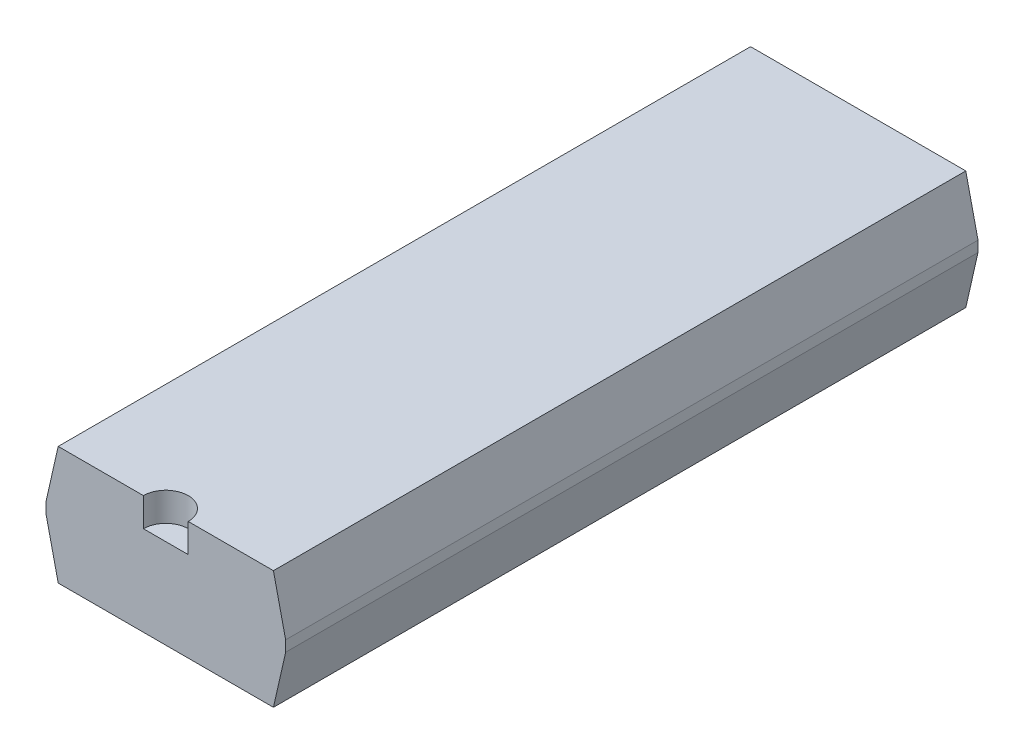
ISO-10303-21;
HEADER;
FILE_DESCRIPTION(('STEP AP214'),'2;1');
FILE_NAME('part.step','',(''),(''),'','','');
FILE_SCHEMA(('AUTOMOTIVE_DESIGN { 1 0 10303 214 1 1 1 1 }'));
ENDSEC;
DATA;
#1=APPLICATION_CONTEXT('core data for automotive mechanical design processes');
#2=APPLICATION_PROTOCOL_DEFINITION('international standard','automotive_design',2000,#1);
#3=PRODUCT_CONTEXT('',#1,'mechanical');
#4=PRODUCT('Part','Part','',(#3));
#5=PRODUCT_RELATED_PRODUCT_CATEGORY('part','',(#4));
#6=PRODUCT_DEFINITION_FORMATION('','',#4);
#7=PRODUCT_DEFINITION_CONTEXT('part definition',#1,'design');
#8=PRODUCT_DEFINITION('design','',#6,#7);
#9=PRODUCT_DEFINITION_SHAPE('','',#8);
#10=(LENGTH_UNIT() NAMED_UNIT(*) SI_UNIT(.MILLI.,.METRE.));
#11=(NAMED_UNIT(*) PLANE_ANGLE_UNIT() SI_UNIT($,.RADIAN.));
#12=(NAMED_UNIT(*) SI_UNIT($,.STERADIAN.) SOLID_ANGLE_UNIT());
#13=UNCERTAINTY_MEASURE_WITH_UNIT(LENGTH_MEASURE(1.E-05),#10,'distance_accuracy_value','');
#14=(GEOMETRIC_REPRESENTATION_CONTEXT(3) GLOBAL_UNCERTAINTY_ASSIGNED_CONTEXT((#13)) GLOBAL_UNIT_ASSIGNED_CONTEXT((#10,
#11,#12)) REPRESENTATION_CONTEXT('',''));
#15=CARTESIAN_POINT('',(0.,0.,0.));
#16=DIRECTION('',(0.,0.,1.));
#17=DIRECTION('',(1.,0.,0.));
#18=AXIS2_PLACEMENT_3D('',#15,#16,#17);
#19=CARTESIAN_POINT('',(0.,0.85,0.));
#20=DIRECTION('',(0.,-1.,0.));
#21=DIRECTION('',(0.,0.,-1.));
#22=AXIS2_PLACEMENT_3D('',#19,#20,#21);
#23=PLANE('',#22);
#24=CARTESIAN_POINT('',(0.,0.85,0.));
#25=DIRECTION('',(0.,-1.,0.));
#26=DIRECTION('',(0.,0.,-1.));
#27=AXIS2_PLACEMENT_3D('',#24,#25,#26);
#28=CIRCLE('',#27,0.625);
#29=CARTESIAN_POINT('',(0.625,0.85,0.));
#30=VERTEX_POINT('',#29);
#31=CARTESIAN_POINT('',(-0.625,0.85,0.));
#32=VERTEX_POINT('',#31);
#33=EDGE_CURVE('E19',#30,#32,#28,.F.);
#34=ORIENTED_EDGE('',*,*,#33,.T.);
#35=DIRECTION('',(1.,0.,0.));
#36=VECTOR('',#35,1.);
#37=CARTESIAN_POINT('',(0.,0.85,0.));
#38=LINE('',#37,#36);
#39=EDGE_CURVE('E90',#30,#32,#38,.F.);
#40=ORIENTED_EDGE('',*,*,#39,.F.);
#41=EDGE_LOOP('',(#34,#40));
#42=FACE_BOUND('',#41,.T.);
#43=ADVANCED_FACE('F16',(#42),#23,.F.);
#44=CARTESIAN_POINT('',(0.,1.65,0.));
#45=DIRECTION('',(0.,-1.,0.));
#46=DIRECTION('',(0.,0.,-1.));
#47=AXIS2_PLACEMENT_3D('',#44,#45,#46);
#48=CYLINDRICAL_SURFACE('',#47,0.625);
#49=CARTESIAN_POINT('',(0.,1.65,0.));
#50=DIRECTION('',(0.,-1.,0.));
#51=DIRECTION('',(0.,0.,-1.));
#52=AXIS2_PLACEMENT_3D('',#49,#50,#51);
#53=CIRCLE('',#52,0.625);
#54=CARTESIAN_POINT('',(-0.625,1.65,0.));
#55=VERTEX_POINT('',#54);
#56=CARTESIAN_POINT('',(0.625,1.65,0.));
#57=VERTEX_POINT('',#56);
#58=EDGE_CURVE('E104',#55,#57,#53,.T.);
#59=ORIENTED_EDGE('',*,*,#58,.F.);
#60=DIRECTION('',(0.,-1.,0.));
#61=VECTOR('',#60,1.);
#62=CARTESIAN_POINT('',(-0.625,1.65,0.));
#63=LINE('',#62,#61);
#64=EDGE_CURVE('E95',#32,#55,#63,.F.);
#65=ORIENTED_EDGE('',*,*,#64,.F.);
#66=ORIENTED_EDGE('',*,*,#33,.F.);
#67=DIRECTION('',(0.,-1.,0.));
#68=VECTOR('',#67,1.);
#69=CARTESIAN_POINT('',(0.625,1.65,0.));
#70=LINE('',#69,#68);
#71=EDGE_CURVE('E98',#57,#30,#70,.T.);
#72=ORIENTED_EDGE('',*,*,#71,.F.);
#73=EDGE_LOOP('',(#59,#65,#66,#72));
#74=FACE_BOUND('',#73,.T.);
#75=ADVANCED_FACE('F102',(#74),#48,.F.);
#76=CARTESIAN_POINT('',(3.34,0.149999999999998,0.));
#77=DIRECTION('',(0.97526042930658,0.221059030642824,0.));
#78=DIRECTION('',(-0.221059030642824,0.97526042930658,0.));
#79=AXIS2_PLACEMENT_3D('',#76,#77,#78);
#80=PLANE('',#79);
#81=DIRECTION('',(-0.221059030642824,0.97526042930658,0.));
#82=VECTOR('',#81,1.);
#83=CARTESIAN_POINT('',(3.34,0.149999999999998,0.));
#84=LINE('',#83,#82);
#85=CARTESIAN_POINT('',(3.,1.65,0.));
#86=VERTEX_POINT('',#85);
#87=CARTESIAN_POINT('',(3.34,0.149999999999998,0.));
#88=VERTEX_POINT('',#87);
#89=EDGE_CURVE('E172',#86,#88,#84,.F.);
#90=ORIENTED_EDGE('',*,*,#89,.T.);
#91=DIRECTION('',(0.,0.,-1.));
#92=VECTOR('',#91,1.);
#93=CARTESIAN_POINT('',(3.34,0.149999999999998,0.));
#94=LINE('',#93,#92);
#95=CARTESIAN_POINT('',(3.34,0.149999999999998,-19.3));
#96=VERTEX_POINT('',#95);
#97=EDGE_CURVE('E134',#96,#88,#94,.F.);
#98=ORIENTED_EDGE('',*,*,#97,.F.);
#99=DIRECTION('',(-0.221059030642824,0.97526042930658,0.));
#100=VECTOR('',#99,1.);
#101=CARTESIAN_POINT('',(3.34,0.149999999999998,-19.3));
#102=LINE('',#101,#100);
#103=CARTESIAN_POINT('',(3.,1.65,-19.3));
#104=VERTEX_POINT('',#103);
#105=EDGE_CURVE('E107',#96,#104,#102,.T.);
#106=ORIENTED_EDGE('',*,*,#105,.T.);
#107=DIRECTION('',(0.,0.,1.));
#108=VECTOR('',#107,1.);
#109=CARTESIAN_POINT('',(3.,1.65,0.));
#110=LINE('',#109,#108);
#111=EDGE_CURVE('E145',#86,#104,#110,.F.);
#112=ORIENTED_EDGE('',*,*,#111,.F.);
#113=EDGE_LOOP('',(#90,#98,#106,#112));
#114=FACE_BOUND('',#113,.T.);
#115=ADVANCED_FACE('F182',(#114),#80,.T.);
#116=CARTESIAN_POINT('',(-3.,1.65,0.));
#117=DIRECTION('',(-0.97526042930658,0.221059030642825,0.));
#118=DIRECTION('',(-0.221059030642825,-0.97526042930658,0.));
#119=AXIS2_PLACEMENT_3D('',#116,#117,#118);
#120=PLANE('',#119);
#121=DIRECTION('',(-0.221059030642825,-0.97526042930658,0.));
#122=VECTOR('',#121,1.);
#123=CARTESIAN_POINT('',(-3.,1.65,0.));
#124=LINE('',#123,#122);
#125=CARTESIAN_POINT('',(-3.34,0.15,0.));
#126=VERTEX_POINT('',#125);
#127=CARTESIAN_POINT('',(-3.,1.65,0.));
#128=VERTEX_POINT('',#127);
#129=EDGE_CURVE('E139',#126,#128,#124,.F.);
#130=ORIENTED_EDGE('',*,*,#129,.T.);
#131=DIRECTION('',(0.,0.,1.));
#132=VECTOR('',#131,1.);
#133=CARTESIAN_POINT('',(-3.,1.65,0.));
#134=LINE('',#133,#132);
#135=CARTESIAN_POINT('',(-3.,1.65,-19.3));
#136=VERTEX_POINT('',#135);
#137=EDGE_CURVE('E117',#136,#128,#134,.T.);
#138=ORIENTED_EDGE('',*,*,#137,.F.);
#139=DIRECTION('',(-0.221059030642825,-0.97526042930658,0.));
#140=VECTOR('',#139,1.);
#141=CARTESIAN_POINT('',(-3.,1.65,-19.3));
#142=LINE('',#141,#140);
#143=CARTESIAN_POINT('',(-3.34,0.15,-19.3));
#144=VERTEX_POINT('',#143);
#145=EDGE_CURVE('E168',#136,#144,#142,.T.);
#146=ORIENTED_EDGE('',*,*,#145,.T.);
#147=DIRECTION('',(0.,0.,1.));
#148=VECTOR('',#147,1.);
#149=CARTESIAN_POINT('',(-3.34,0.15,0.));
#150=LINE('',#149,#148);
#151=EDGE_CURVE('E113',#126,#144,#150,.F.);
#152=ORIENTED_EDGE('',*,*,#151,.F.);
#153=EDGE_LOOP('',(#130,#138,#146,#152));
#154=FACE_BOUND('',#153,.T.);
#155=ADVANCED_FACE('F193',(#154),#120,.T.);
#156=CARTESIAN_POINT('',(3.34,-0.150000000000001,0.));
#157=DIRECTION('',(1.,0.,0.));
#158=DIRECTION('',(0.,0.,-1.));
#159=AXIS2_PLACEMENT_3D('',#156,#157,#158);
#160=PLANE('',#159);
#161=DIRECTION('',(0.,1.,0.));
#162=VECTOR('',#161,1.);
#163=CARTESIAN_POINT('',(3.34,-0.150000000000001,0.));
#164=LINE('',#163,#162);
#165=CARTESIAN_POINT('',(3.34,-0.150000000000001,0.));
#166=VERTEX_POINT('',#165);
#167=EDGE_CURVE('E132',#88,#166,#164,.F.);
#168=ORIENTED_EDGE('',*,*,#167,.T.);
#169=DIRECTION('',(0.,0.,1.));
#170=VECTOR('',#169,1.);
#171=CARTESIAN_POINT('',(3.34,-0.150000000000001,0.));
#172=LINE('',#171,#170);
#173=CARTESIAN_POINT('',(3.34,-0.150000000000002,-19.3));
#174=VERTEX_POINT('',#173);
#175=EDGE_CURVE('E162',#174,#166,#172,.T.);
#176=ORIENTED_EDGE('',*,*,#175,.F.);
#177=DIRECTION('',(0.,1.,0.));
#178=VECTOR('',#177,1.);
#179=CARTESIAN_POINT('',(3.34,0.,-19.3));
#180=LINE('',#179,#178);
#181=EDGE_CURVE('E116',#174,#96,#180,.T.);
#182=ORIENTED_EDGE('',*,*,#181,.T.);
#183=ORIENTED_EDGE('',*,*,#97,.T.);
#184=EDGE_LOOP('',(#168,#176,#182,#183));
#185=FACE_BOUND('',#184,.T.);
#186=ADVANCED_FACE('F218',(#185),#160,.T.);
#187=CARTESIAN_POINT('',(3.,1.65,0.));
#188=DIRECTION('',(0.,1.,0.));
#189=DIRECTION('',(0.,0.,1.));
#190=AXIS2_PLACEMENT_3D('',#187,#188,#189);
#191=PLANE('',#190);
#192=ORIENTED_EDGE('',*,*,#137,.T.);
#193=DIRECTION('',(1.,0.,0.));
#194=VECTOR('',#193,1.);
#195=CARTESIAN_POINT('',(0.,1.65,0.));
#196=LINE('',#195,#194);
#197=EDGE_CURVE('E123',#55,#128,#196,.F.);
#198=ORIENTED_EDGE('',*,*,#197,.F.);
#199=ORIENTED_EDGE('',*,*,#58,.T.);
#200=DIRECTION('',(1.,0.,0.));
#201=VECTOR('',#200,1.);
#202=CARTESIAN_POINT('',(0.,1.65,0.));
#203=LINE('',#202,#201);
#204=EDGE_CURVE('E207',#86,#57,#203,.F.);
#205=ORIENTED_EDGE('',*,*,#204,.F.);
#206=ORIENTED_EDGE('',*,*,#111,.T.);
#207=DIRECTION('',(1.,0.,0.));
#208=VECTOR('',#207,1.);
#209=CARTESIAN_POINT('',(0.,1.65,-19.3));
#210=LINE('',#209,#208);
#211=EDGE_CURVE('E129',#104,#136,#210,.F.);
#212=ORIENTED_EDGE('',*,*,#211,.T.);
#213=EDGE_LOOP('',(#192,#198,#199,#205,#206,#212));
#214=FACE_BOUND('',#213,.T.);
#215=ADVANCED_FACE('F188',(#214),#191,.T.);
#216=CARTESIAN_POINT('',(-3.34,0.15,0.));
#217=DIRECTION('',(-1.,0.,0.));
#218=DIRECTION('',(0.,0.,1.));
#219=AXIS2_PLACEMENT_3D('',#216,#217,#218);
#220=PLANE('',#219);
#221=DIRECTION('',(0.,1.,0.));
#222=VECTOR('',#221,1.);
#223=CARTESIAN_POINT('',(-3.34,0.,0.));
#224=LINE('',#223,#222);
#225=CARTESIAN_POINT('',(-3.34,-0.15,0.));
#226=VERTEX_POINT('',#225);
#227=EDGE_CURVE('E120',#126,#226,#224,.F.);
#228=ORIENTED_EDGE('',*,*,#227,.F.);
#229=ORIENTED_EDGE('',*,*,#151,.T.);
#230=DIRECTION('',(0.,1.,0.));
#231=VECTOR('',#230,1.);
#232=CARTESIAN_POINT('',(-3.34,0.,-19.3));
#233=LINE('',#232,#231);
#234=CARTESIAN_POINT('',(-3.34,-0.15,-19.3));
#235=VERTEX_POINT('',#234);
#236=EDGE_CURVE('E126',#144,#235,#233,.F.);
#237=ORIENTED_EDGE('',*,*,#236,.T.);
#238=DIRECTION('',(0.,0.,1.));
#239=VECTOR('',#238,1.);
#240=CARTESIAN_POINT('',(-3.34,-0.15,0.));
#241=LINE('',#240,#239);
#242=EDGE_CURVE('E197',#226,#235,#241,.F.);
#243=ORIENTED_EDGE('',*,*,#242,.F.);
#244=EDGE_LOOP('',(#228,#229,#237,#243));
#245=FACE_BOUND('',#244,.T.);
#246=ADVANCED_FACE('F195',(#245),#220,.T.);
#247=CARTESIAN_POINT('',(0.,0.,-19.3));
#248=DIRECTION('',(0.,0.,1.));
#249=DIRECTION('',(1.,0.,0.));
#250=AXIS2_PLACEMENT_3D('',#247,#248,#249);
#251=PLANE('',#250);
#252=ORIENTED_EDGE('',*,*,#236,.F.);
#253=ORIENTED_EDGE('',*,*,#145,.F.);
#254=ORIENTED_EDGE('',*,*,#211,.F.);
#255=ORIENTED_EDGE('',*,*,#105,.F.);
#256=ORIENTED_EDGE('',*,*,#181,.F.);
#257=DIRECTION('',(0.221059030642825,0.97526042930658,0.));
#258=VECTOR('',#257,1.);
#259=CARTESIAN_POINT('',(3.,-1.65,-19.3));
#260=LINE('',#259,#258);
#261=CARTESIAN_POINT('',(3.,-1.65,-19.3));
#262=VERTEX_POINT('',#261);
#263=EDGE_CURVE('E128',#262,#174,#260,.T.);
#264=ORIENTED_EDGE('',*,*,#263,.F.);
#265=DIRECTION('',(1.,0.,0.));
#266=VECTOR('',#265,1.);
#267=CARTESIAN_POINT('',(-3.,-1.65,-19.3));
#268=LINE('',#267,#266);
#269=CARTESIAN_POINT('',(-3.,-1.65,-19.3));
#270=VERTEX_POINT('',#269);
#271=EDGE_CURVE('E201',#270,#262,#268,.T.);
#272=ORIENTED_EDGE('',*,*,#271,.F.);
#273=DIRECTION('',(0.221059030642824,-0.97526042930658,0.));
#274=VECTOR('',#273,1.);
#275=CARTESIAN_POINT('',(-3.34,-0.15,-19.3));
#276=LINE('',#275,#274);
#277=EDGE_CURVE('E205',#235,#270,#276,.T.);
#278=ORIENTED_EDGE('',*,*,#277,.F.);
#279=EDGE_LOOP('',(#252,#253,#254,#255,#256,#264,#272,#278));
#280=FACE_BOUND('',#279,.T.);
#281=ADVANCED_FACE('F185',(#280),#251,.F.);
#282=CARTESIAN_POINT('',(3.,-1.65,0.));
#283=DIRECTION('',(0.97526042930658,-0.221059030642825,0.));
#284=DIRECTION('',(0.221059030642825,0.97526042930658,0.));
#285=AXIS2_PLACEMENT_3D('',#282,#283,#284);
#286=PLANE('',#285);
#287=DIRECTION('',(0.221059030642825,0.97526042930658,0.));
#288=VECTOR('',#287,1.);
#289=CARTESIAN_POINT('',(3.,-1.65,0.));
#290=LINE('',#289,#288);
#291=CARTESIAN_POINT('',(3.,-1.65,0.));
#292=VERTEX_POINT('',#291);
#293=EDGE_CURVE('E122',#292,#166,#290,.T.);
#294=ORIENTED_EDGE('',*,*,#293,.F.);
#295=DIRECTION('',(0.,0.,-1.));
#296=VECTOR('',#295,1.);
#297=CARTESIAN_POINT('',(3.,-1.65,0.));
#298=LINE('',#297,#296);
#299=EDGE_CURVE('E223',#262,#292,#298,.F.);
#300=ORIENTED_EDGE('',*,*,#299,.F.);
#301=ORIENTED_EDGE('',*,*,#263,.T.);
#302=ORIENTED_EDGE('',*,*,#175,.T.);
#303=EDGE_LOOP('',(#294,#300,#301,#302));
#304=FACE_BOUND('',#303,.T.);
#305=ADVANCED_FACE('F221',(#304),#286,.T.);
#306=CARTESIAN_POINT('',(0.,0.,0.));
#307=DIRECTION('',(0.,0.,1.));
#308=DIRECTION('',(1.,0.,0.));
#309=AXIS2_PLACEMENT_3D('',#306,#307,#308);
#310=PLANE('',#309);
#311=ORIENTED_EDGE('',*,*,#89,.F.);
#312=ORIENTED_EDGE('',*,*,#204,.T.);
#313=ORIENTED_EDGE('',*,*,#71,.T.);
#314=ORIENTED_EDGE('',*,*,#39,.T.);
#315=ORIENTED_EDGE('',*,*,#64,.T.);
#316=ORIENTED_EDGE('',*,*,#197,.T.);
#317=ORIENTED_EDGE('',*,*,#129,.F.);
#318=ORIENTED_EDGE('',*,*,#227,.T.);
#319=DIRECTION('',(0.221059030642824,-0.97526042930658,0.));
#320=VECTOR('',#319,1.);
#321=CARTESIAN_POINT('',(-3.34,-0.15,0.));
#322=LINE('',#321,#320);
#323=CARTESIAN_POINT('',(-3.,-1.65,0.));
#324=VERTEX_POINT('',#323);
#325=EDGE_CURVE('E34',#324,#226,#322,.F.);
#326=ORIENTED_EDGE('',*,*,#325,.F.);
#327=DIRECTION('',(1.,0.,0.));
#328=VECTOR('',#327,1.);
#329=CARTESIAN_POINT('',(-3.,-1.65,0.));
#330=LINE('',#329,#328);
#331=EDGE_CURVE('E25',#292,#324,#330,.F.);
#332=ORIENTED_EDGE('',*,*,#331,.F.);
#333=ORIENTED_EDGE('',*,*,#293,.T.);
#334=ORIENTED_EDGE('',*,*,#167,.F.);
#335=EDGE_LOOP('',(#311,#312,#313,#314,#315,#316,#317,#318,#326,#332,#333,#334));
#336=FACE_BOUND('',#335,.T.);
#337=ADVANCED_FACE('F92',(#336),#310,.T.);
#338=CARTESIAN_POINT('',(-3.34,-0.15,0.));
#339=DIRECTION('',(-0.97526042930658,-0.221059030642824,0.));
#340=DIRECTION('',(0.221059030642824,-0.97526042930658,0.));
#341=AXIS2_PLACEMENT_3D('',#338,#339,#340);
#342=PLANE('',#341);
#343=ORIENTED_EDGE('',*,*,#325,.T.);
#344=ORIENTED_EDGE('',*,*,#242,.T.);
#345=ORIENTED_EDGE('',*,*,#277,.T.);
#346=DIRECTION('',(0.,0.,-1.));
#347=VECTOR('',#346,1.);
#348=CARTESIAN_POINT('',(-3.,-1.65,0.));
#349=LINE('',#348,#347);
#350=EDGE_CURVE('E11',#324,#270,#349,.T.);
#351=ORIENTED_EDGE('',*,*,#350,.F.);
#352=EDGE_LOOP('',(#343,#344,#345,#351));
#353=FACE_BOUND('',#352,.T.);
#354=ADVANCED_FACE('F203',(#353),#342,.T.);
#355=CARTESIAN_POINT('',(-3.,-1.65,0.));
#356=DIRECTION('',(0.,-1.,0.));
#357=DIRECTION('',(0.,0.,-1.));
#358=AXIS2_PLACEMENT_3D('',#355,#356,#357);
#359=PLANE('',#358);
#360=ORIENTED_EDGE('',*,*,#331,.T.);
#361=ORIENTED_EDGE('',*,*,#350,.T.);
#362=ORIENTED_EDGE('',*,*,#271,.T.);
#363=ORIENTED_EDGE('',*,*,#299,.T.);
#364=EDGE_LOOP('',(#360,#361,#362,#363));
#365=FACE_BOUND('',#364,.T.);
#366=ADVANCED_FACE('F226',(#365),#359,.T.);
#367=CLOSED_SHELL('',(#43,#75,#115,#155,#186,#215,#246,#281,#305,#337,#354,#366));
#368=MANIFOLD_SOLID_BREP('B1',#367);
#369=ADVANCED_BREP_SHAPE_REPRESENTATION('',(#18,#368),#14);
#370=SHAPE_DEFINITION_REPRESENTATION(#9,#369);
ENDSEC;
END-ISO-10303-21;
